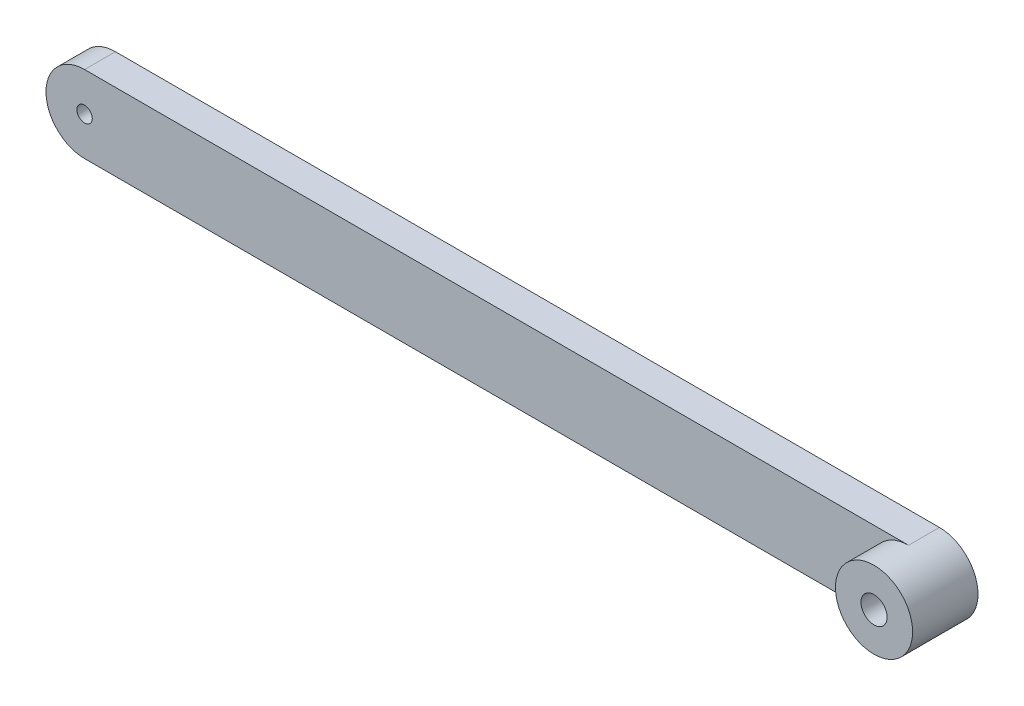
ISO-10303-21;
HEADER;
FILE_DESCRIPTION(('STEP AP214'),'2;1');
FILE_NAME('part.step','',(''),(''),'','','');
FILE_SCHEMA(('AUTOMOTIVE_DESIGN { 1 0 10303 214 1 1 1 1 }'));
ENDSEC;
DATA;
#1=APPLICATION_CONTEXT('core data for automotive mechanical design processes');
#2=APPLICATION_PROTOCOL_DEFINITION('international standard','automotive_design',2000,#1);
#3=PRODUCT_CONTEXT('',#1,'mechanical');
#4=PRODUCT('Part','Part','',(#3));
#5=PRODUCT_RELATED_PRODUCT_CATEGORY('part','',(#4));
#6=PRODUCT_DEFINITION_FORMATION('','',#4);
#7=PRODUCT_DEFINITION_CONTEXT('part definition',#1,'design');
#8=PRODUCT_DEFINITION('design','',#6,#7);
#9=PRODUCT_DEFINITION_SHAPE('','',#8);
#10=(LENGTH_UNIT() NAMED_UNIT(*) SI_UNIT(.MILLI.,.METRE.));
#11=(NAMED_UNIT(*) PLANE_ANGLE_UNIT() SI_UNIT($,.RADIAN.));
#12=(NAMED_UNIT(*) SI_UNIT($,.STERADIAN.) SOLID_ANGLE_UNIT());
#13=UNCERTAINTY_MEASURE_WITH_UNIT(LENGTH_MEASURE(1.E-05),#10,'distance_accuracy_value','');
#14=(GEOMETRIC_REPRESENTATION_CONTEXT(3) GLOBAL_UNCERTAINTY_ASSIGNED_CONTEXT((#13)) GLOBAL_UNIT_ASSIGNED_CONTEXT((#10,
#11,#12)) REPRESENTATION_CONTEXT('',''));
#15=CARTESIAN_POINT('',(0.,0.,0.));
#16=DIRECTION('',(0.,0.,1.));
#17=DIRECTION('',(1.,0.,0.));
#18=AXIS2_PLACEMENT_3D('',#15,#16,#17);
#19=CARTESIAN_POINT('',(-26.705,0.,2.));
#20=DIRECTION('',(0.,0.,-1.));
#21=DIRECTION('',(-1.,0.,0.));
#22=AXIS2_PLACEMENT_3D('',#19,#20,#21);
#23=CYLINDRICAL_SURFACE('',#22,2.5);
#24=CARTESIAN_POINT('',(-26.705,0.,0.));
#25=DIRECTION('',(0.,0.,1.));
#26=DIRECTION('',(1.,0.,0.));
#27=AXIS2_PLACEMENT_3D('',#24,#25,#26);
#28=CIRCLE('',#27,2.5);
#29=CARTESIAN_POINT('',(-26.705,2.5,0.));
#30=VERTEX_POINT('',#29);
#31=CARTESIAN_POINT('',(-26.705,-2.5,0.));
#32=VERTEX_POINT('',#31);
#33=EDGE_CURVE('E94',#30,#32,#28,.T.);
#34=ORIENTED_EDGE('',*,*,#33,.T.);
#35=DIRECTION('',(0.,0.,-1.));
#36=VECTOR('',#35,1.);
#37=CARTESIAN_POINT('',(-26.705,-2.5,2.));
#38=LINE('',#37,#36);
#39=CARTESIAN_POINT('',(-26.705,-2.5,2.));
#40=VERTEX_POINT('',#39);
#41=EDGE_CURVE('E11',#40,#32,#38,.T.);
#42=ORIENTED_EDGE('',*,*,#41,.F.);
#43=CARTESIAN_POINT('',(-26.705,0.,2.));
#44=DIRECTION('',(0.,0.,1.));
#45=DIRECTION('',(1.,0.,0.));
#46=AXIS2_PLACEMENT_3D('',#43,#44,#45);
#47=CIRCLE('',#46,2.5);
#48=CARTESIAN_POINT('',(-26.705,2.5,2.));
#49=VERTEX_POINT('',#48);
#50=EDGE_CURVE('E100',#49,#40,#47,.T.);
#51=ORIENTED_EDGE('',*,*,#50,.F.);
#52=DIRECTION('',(0.,0.,-1.));
#53=VECTOR('',#52,1.);
#54=CARTESIAN_POINT('',(-26.705,2.5,2.));
#55=LINE('',#54,#53);
#56=EDGE_CURVE('E81',#49,#30,#55,.T.);
#57=ORIENTED_EDGE('',*,*,#56,.T.);
#58=EDGE_LOOP('',(#34,#42,#51,#57));
#59=FACE_BOUND('',#58,.T.);
#60=ADVANCED_FACE('F32',(#59),#23,.T.);
#61=CARTESIAN_POINT('',(-26.705,-2.5,2.));
#62=DIRECTION('',(0.,1.,0.));
#63=DIRECTION('',(-1.,0.,0.));
#64=AXIS2_PLACEMENT_3D('',#61,#62,#63);
#65=PLANE('',#64);
#66=DIRECTION('',(1.,0.,0.));
#67=VECTOR('',#66,1.);
#68=CARTESIAN_POINT('',(-26.705,-2.5,0.));
#69=LINE('',#68,#67);
#70=CARTESIAN_POINT('',(26.705,-2.49999999999999,0.));
#71=VERTEX_POINT('',#70);
#72=EDGE_CURVE('E105',#32,#71,#69,.T.);
#73=ORIENTED_EDGE('',*,*,#72,.T.);
#74=DIRECTION('',(0.,0.,-1.));
#75=VECTOR('',#74,1.);
#76=CARTESIAN_POINT('',(26.705,-2.49999999999999,2.));
#77=LINE('',#76,#75);
#78=CARTESIAN_POINT('',(26.705,-2.49999999999999,2.));
#79=VERTEX_POINT('',#78);
#80=EDGE_CURVE('E40',#79,#71,#77,.T.);
#81=ORIENTED_EDGE('',*,*,#80,.F.);
#82=DIRECTION('',(1.,0.,0.));
#83=VECTOR('',#82,1.);
#84=CARTESIAN_POINT('',(-26.705,-2.5,2.));
#85=LINE('',#84,#83);
#86=EDGE_CURVE('E77',#40,#79,#85,.T.);
#87=ORIENTED_EDGE('',*,*,#86,.F.);
#88=ORIENTED_EDGE('',*,*,#41,.T.);
#89=EDGE_LOOP('',(#73,#81,#87,#88));
#90=FACE_BOUND('',#89,.T.);
#91=ADVANCED_FACE('F114',(#90),#65,.F.);
#92=CARTESIAN_POINT('',(26.705,0.,2.));
#93=DIRECTION('',(0.,0.,-1.));
#94=DIRECTION('',(-1.,0.,0.));
#95=AXIS2_PLACEMENT_3D('',#92,#93,#94);
#96=CYLINDRICAL_SURFACE('',#95,2.5);
#97=CARTESIAN_POINT('',(26.705,0.,0.));
#98=DIRECTION('',(0.,0.,1.));
#99=DIRECTION('',(1.,0.,0.));
#100=AXIS2_PLACEMENT_3D('',#97,#98,#99);
#101=CIRCLE('',#100,2.5);
#102=CARTESIAN_POINT('',(26.705,2.50000000000001,0.));
#103=VERTEX_POINT('',#102);
#104=EDGE_CURVE('E67',#71,#103,#101,.T.);
#105=ORIENTED_EDGE('',*,*,#104,.T.);
#106=DIRECTION('',(0.,0.,-1.));
#107=VECTOR('',#106,1.);
#108=CARTESIAN_POINT('',(26.705,2.50000000000001,2.));
#109=LINE('',#108,#107);
#110=CARTESIAN_POINT('',(26.705,2.50000000000001,2.));
#111=VERTEX_POINT('',#110);
#112=EDGE_CURVE('E80',#111,#103,#109,.T.);
#113=ORIENTED_EDGE('',*,*,#112,.F.);
#114=CARTESIAN_POINT('',(26.705,0.,2.));
#115=DIRECTION('',(0.,0.,1.));
#116=DIRECTION('',(1.,0.,0.));
#117=AXIS2_PLACEMENT_3D('',#114,#115,#116);
#118=CIRCLE('',#117,2.5);
#119=EDGE_CURVE('E87',#111,#79,#118,.T.);
#120=ORIENTED_EDGE('',*,*,#119,.T.);
#121=ORIENTED_EDGE('',*,*,#80,.T.);
#122=EDGE_LOOP('',(#105,#113,#120,#121));
#123=FACE_BOUND('',#122,.T.);
#124=CARTESIAN_POINT('',(26.705,0.,4.24));
#125=DIRECTION('',(0.,0.,1.));
#126=DIRECTION('',(1.,0.,0.));
#127=AXIS2_PLACEMENT_3D('',#124,#125,#126);
#128=CIRCLE('',#127,2.5);
#129=CARTESIAN_POINT('',(29.205,0.,4.24));
#130=VERTEX_POINT('',#129);
#131=EDGE_CURVE('E90',#130,#130,#128,.T.);
#132=ORIENTED_EDGE('',*,*,#131,.F.);
#133=EDGE_LOOP('',(#132));
#134=FACE_BOUND('',#133,.T.);
#135=ADVANCED_FACE('F85',(#123,#134),#96,.T.);
#136=CARTESIAN_POINT('',(-26.705,2.5,2.));
#137=DIRECTION('',(0.,-1.,0.));
#138=DIRECTION('',(1.,0.,0.));
#139=AXIS2_PLACEMENT_3D('',#136,#137,#138);
#140=PLANE('',#139);
#141=DIRECTION('',(-1.,0.,0.));
#142=VECTOR('',#141,1.);
#143=CARTESIAN_POINT('',(-26.705,2.5,0.));
#144=LINE('',#143,#142);
#145=EDGE_CURVE('E72',#103,#30,#144,.T.);
#146=ORIENTED_EDGE('',*,*,#145,.T.);
#147=ORIENTED_EDGE('',*,*,#56,.F.);
#148=DIRECTION('',(-1.,0.,0.));
#149=VECTOR('',#148,1.);
#150=CARTESIAN_POINT('',(-26.705,2.5,2.));
#151=LINE('',#150,#149);
#152=EDGE_CURVE('E48',#111,#49,#151,.T.);
#153=ORIENTED_EDGE('',*,*,#152,.F.);
#154=ORIENTED_EDGE('',*,*,#112,.T.);
#155=EDGE_LOOP('',(#146,#147,#153,#154));
#156=FACE_BOUND('',#155,.T.);
#157=ADVANCED_FACE('F79',(#156),#140,.F.);
#158=CARTESIAN_POINT('',(-26.705,0.,2.));
#159=DIRECTION('',(0.,0.,1.));
#160=DIRECTION('',(1.,0.,0.));
#161=AXIS2_PLACEMENT_3D('',#158,#159,#160);
#162=PLANE('',#161);
#163=CARTESIAN_POINT('',(-26.705,0.,2.));
#164=DIRECTION('',(0.,0.,1.));
#165=DIRECTION('',(1.,0.,0.));
#166=AXIS2_PLACEMENT_3D('',#163,#164,#165);
#167=CIRCLE('',#166,0.499999999999999);
#168=CARTESIAN_POINT('',(-26.205,0.,2.));
#169=VERTEX_POINT('',#168);
#170=EDGE_CURVE('E91',#169,#169,#167,.T.);
#171=ORIENTED_EDGE('',*,*,#170,.F.);
#172=EDGE_LOOP('',(#171));
#173=FACE_BOUND('',#172,.T.);
#174=ORIENTED_EDGE('',*,*,#119,.F.);
#175=ORIENTED_EDGE('',*,*,#152,.T.);
#176=ORIENTED_EDGE('',*,*,#50,.T.);
#177=ORIENTED_EDGE('',*,*,#86,.T.);
#178=EDGE_LOOP('',(#174,#175,#176,#177));
#179=FACE_BOUND('',#178,.T.);
#180=ADVANCED_FACE('F89',(#173,#179),#162,.T.);
#181=CARTESIAN_POINT('',(-26.705,0.,0.));
#182=DIRECTION('',(0.,0.,1.));
#183=DIRECTION('',(1.,0.,0.));
#184=AXIS2_PLACEMENT_3D('',#181,#182,#183);
#185=PLANE('',#184);
#186=CARTESIAN_POINT('',(26.705,0.,0.));
#187=DIRECTION('',(0.,0.,1.));
#188=DIRECTION('',(1.,0.,0.));
#189=AXIS2_PLACEMENT_3D('',#186,#187,#188);
#190=CIRCLE('',#189,0.85);
#191=CARTESIAN_POINT('',(27.555,0.,0.));
#192=VERTEX_POINT('',#191);
#193=EDGE_CURVE('E146',#192,#192,#190,.T.);
#194=ORIENTED_EDGE('',*,*,#193,.T.);
#195=EDGE_LOOP('',(#194));
#196=FACE_BOUND('',#195,.T.);
#197=CARTESIAN_POINT('',(-26.705,0.,0.));
#198=DIRECTION('',(0.,0.,-1.));
#199=DIRECTION('',(-1.,0.,0.));
#200=AXIS2_PLACEMENT_3D('',#197,#198,#199);
#201=CIRCLE('',#200,0.499999999999999);
#202=CARTESIAN_POINT('',(-27.205,0.,0.));
#203=VERTEX_POINT('',#202);
#204=EDGE_CURVE('E97',#203,#203,#201,.T.);
#205=ORIENTED_EDGE('',*,*,#204,.F.);
#206=EDGE_LOOP('',(#205));
#207=FACE_BOUND('',#206,.T.);
#208=ORIENTED_EDGE('',*,*,#33,.F.);
#209=ORIENTED_EDGE('',*,*,#145,.F.);
#210=ORIENTED_EDGE('',*,*,#104,.F.);
#211=ORIENTED_EDGE('',*,*,#72,.F.);
#212=EDGE_LOOP('',(#208,#209,#210,#211));
#213=FACE_BOUND('',#212,.T.);
#214=ADVANCED_FACE('F111',(#196,#207,#213),#185,.F.);
#215=CARTESIAN_POINT('',(26.705,0.,4.24));
#216=DIRECTION('',(0.,0.,1.));
#217=DIRECTION('',(1.,0.,0.));
#218=AXIS2_PLACEMENT_3D('',#215,#216,#217);
#219=PLANE('',#218);
#220=CARTESIAN_POINT('',(26.705,0.,4.24));
#221=DIRECTION('',(0.,0.,1.));
#222=DIRECTION('',(1.,0.,0.));
#223=AXIS2_PLACEMENT_3D('',#220,#221,#222);
#224=CIRCLE('',#223,0.85);
#225=CARTESIAN_POINT('',(27.555,0.,4.24));
#226=VERTEX_POINT('',#225);
#227=EDGE_CURVE('E149',#226,#226,#224,.T.);
#228=ORIENTED_EDGE('',*,*,#227,.F.);
#229=EDGE_LOOP('',(#228));
#230=FACE_BOUND('',#229,.T.);
#231=ORIENTED_EDGE('',*,*,#131,.T.);
#232=EDGE_LOOP('',(#231));
#233=FACE_BOUND('',#232,.T.);
#234=ADVANCED_FACE('F126',(#230,#233),#219,.T.);
#235=CARTESIAN_POINT('',(-26.705,0.,4.24));
#236=DIRECTION('',(0.,0.,-1.));
#237=DIRECTION('',(-1.,0.,0.));
#238=AXIS2_PLACEMENT_3D('',#235,#236,#237);
#239=CYLINDRICAL_SURFACE('',#238,0.499999999999999);
#240=ORIENTED_EDGE('',*,*,#170,.T.);
#241=EDGE_LOOP('',(#240));
#242=FACE_BOUND('',#241,.T.);
#243=ORIENTED_EDGE('',*,*,#204,.T.);
#244=EDGE_LOOP('',(#243));
#245=FACE_BOUND('',#244,.T.);
#246=ADVANCED_FACE('F133',(#242,#245),#239,.F.);
#247=CARTESIAN_POINT('',(26.705,0.,0.));
#248=DIRECTION('',(0.,0.,1.));
#249=DIRECTION('',(1.,0.,0.));
#250=AXIS2_PLACEMENT_3D('',#247,#248,#249);
#251=CYLINDRICAL_SURFACE('',#250,0.85);
#252=ORIENTED_EDGE('',*,*,#193,.F.);
#253=EDGE_LOOP('',(#252));
#254=FACE_BOUND('',#253,.T.);
#255=ORIENTED_EDGE('',*,*,#227,.T.);
#256=EDGE_LOOP('',(#255));
#257=FACE_BOUND('',#256,.T.);
#258=ADVANCED_FACE('F137',(#254,#257),#251,.F.);
#259=CLOSED_SHELL('',(#60,#91,#135,#157,#180,#214,#234,#246,#258));
#260=MANIFOLD_SOLID_BREP('B2',#259);
#261=ADVANCED_BREP_SHAPE_REPRESENTATION('',(#18,#260),#14);
#262=SHAPE_DEFINITION_REPRESENTATION(#9,#261);
ENDSEC;
END-ISO-10303-21;
